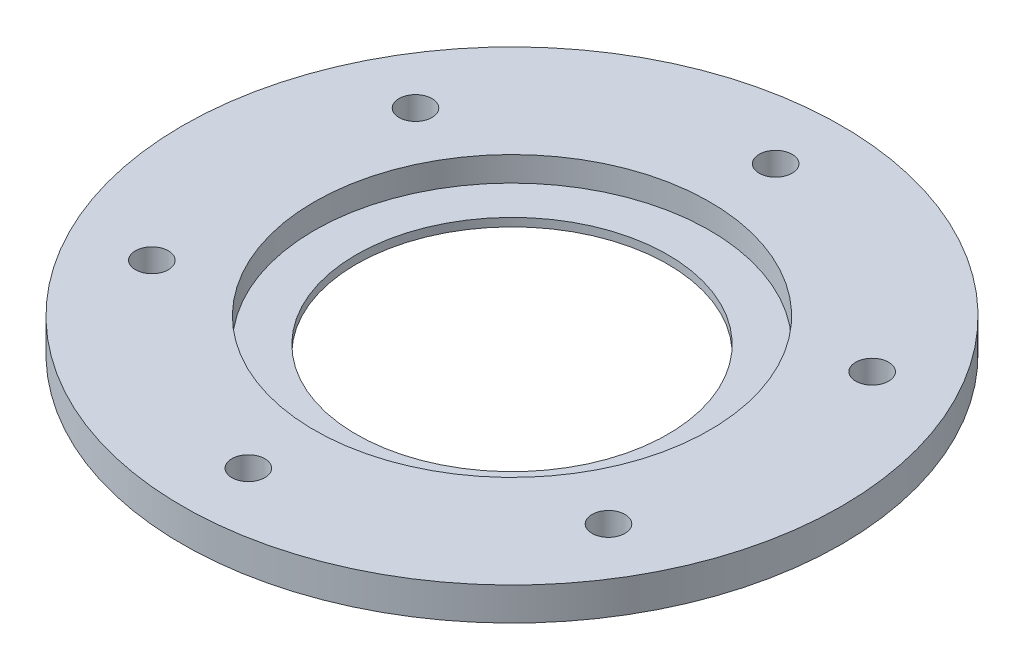
ISO-10303-21;
HEADER;
FILE_DESCRIPTION(('STEP AP214'),'2;1');
FILE_NAME('part.step','',(''),(''),'','','');
FILE_SCHEMA(('AUTOMOTIVE_DESIGN { 1 0 10303 214 1 1 1 1 }'));
ENDSEC;
DATA;
#1=APPLICATION_CONTEXT('core data for automotive mechanical design processes');
#2=APPLICATION_PROTOCOL_DEFINITION('international standard','automotive_design',2000,#1);
#3=PRODUCT_CONTEXT('',#1,'mechanical');
#4=PRODUCT('Part','Part','',(#3));
#5=PRODUCT_RELATED_PRODUCT_CATEGORY('part','',(#4));
#6=PRODUCT_DEFINITION_FORMATION('','',#4);
#7=PRODUCT_DEFINITION_CONTEXT('part definition',#1,'design');
#8=PRODUCT_DEFINITION('design','',#6,#7);
#9=PRODUCT_DEFINITION_SHAPE('','',#8);
#10=(LENGTH_UNIT() NAMED_UNIT(*) SI_UNIT(.MILLI.,.METRE.));
#11=(NAMED_UNIT(*) PLANE_ANGLE_UNIT() SI_UNIT($,.RADIAN.));
#12=(NAMED_UNIT(*) SI_UNIT($,.STERADIAN.) SOLID_ANGLE_UNIT());
#13=UNCERTAINTY_MEASURE_WITH_UNIT(LENGTH_MEASURE(1.E-05),#10,'distance_accuracy_value','');
#14=(GEOMETRIC_REPRESENTATION_CONTEXT(3) GLOBAL_UNCERTAINTY_ASSIGNED_CONTEXT((#13)) GLOBAL_UNIT_ASSIGNED_CONTEXT((#10,
#11,#12)) REPRESENTATION_CONTEXT('',''));
#15=CARTESIAN_POINT('',(0.,0.,0.));
#16=DIRECTION('',(0.,0.,1.));
#17=DIRECTION('',(1.,0.,0.));
#18=AXIS2_PLACEMENT_3D('',#15,#16,#17);
#19=CARTESIAN_POINT('',(200.,0.,0.));
#20=DIRECTION('',(0.,1.,0.));
#21=DIRECTION('',(-1.,0.,0.));
#22=AXIS2_PLACEMENT_3D('',#19,#20,#21);
#23=PLANE('',#22);
#24=CARTESIAN_POINT('',(0.,0.,-160.));
#25=DIRECTION('',(0.,1.,0.));
#26=DIRECTION('',(-1.,0.,0.));
#27=AXIS2_PLACEMENT_3D('',#24,#25,#26);
#28=CIRCLE('',#27,10.);
#29=CARTESIAN_POINT('',(-10.,0.,-160.));
#30=VERTEX_POINT('',#29);
#31=EDGE_CURVE('E57',#30,#30,#28,.F.);
#32=ORIENTED_EDGE('',*,*,#31,.F.);
#33=EDGE_LOOP('',(#32));
#34=FACE_BOUND('',#33,.T.);
#35=CARTESIAN_POINT('',(-138.564064605505,0.,-79.999999999991));
#36=DIRECTION('',(0.,1.,0.));
#37=DIRECTION('',(-1.,0.,0.));
#38=AXIS2_PLACEMENT_3D('',#35,#36,#37);
#39=CIRCLE('',#38,10.);
#40=CARTESIAN_POINT('',(-148.564064605505,0.,-79.999999999991));
#41=VERTEX_POINT('',#40);
#42=EDGE_CURVE('E65',#41,#41,#39,.F.);
#43=ORIENTED_EDGE('',*,*,#42,.F.);
#44=EDGE_LOOP('',(#43));
#45=FACE_BOUND('',#44,.T.);
#46=CARTESIAN_POINT('',(-138.564064605495,0.,80.0000000000089));
#47=DIRECTION('',(0.,1.,0.));
#48=DIRECTION('',(-1.,0.,0.));
#49=AXIS2_PLACEMENT_3D('',#46,#47,#48);
#50=CIRCLE('',#49,10.);
#51=CARTESIAN_POINT('',(-148.564064605495,0.,80.0000000000089));
#52=VERTEX_POINT('',#51);
#53=EDGE_CURVE('E58',#52,#52,#50,.F.);
#54=ORIENTED_EDGE('',*,*,#53,.F.);
#55=EDGE_LOOP('',(#54));
#56=FACE_BOUND('',#55,.T.);
#57=CARTESIAN_POINT('',(2.04218391923969E-11,0.,160.));
#58=DIRECTION('',(0.,1.,0.));
#59=DIRECTION('',(-1.,0.,0.));
#60=AXIS2_PLACEMENT_3D('',#57,#58,#59);
#61=CIRCLE('',#60,10.);
#62=CARTESIAN_POINT('',(-9.99999999997958,0.,160.));
#63=VERTEX_POINT('',#62);
#64=EDGE_CURVE('E66',#63,#63,#61,.F.);
#65=ORIENTED_EDGE('',*,*,#64,.F.);
#66=EDGE_LOOP('',(#65));
#67=FACE_BOUND('',#66,.T.);
#68=CARTESIAN_POINT('',(138.564064605526,0.,79.9999999999911));
#69=DIRECTION('',(0.,1.,0.));
#70=DIRECTION('',(-1.,0.,0.));
#71=AXIS2_PLACEMENT_3D('',#68,#69,#70);
#72=CIRCLE('',#71,10.);
#73=CARTESIAN_POINT('',(128.564064605526,0.,79.9999999999911));
#74=VERTEX_POINT('',#73);
#75=EDGE_CURVE('E72',#74,#74,#72,.F.);
#76=ORIENTED_EDGE('',*,*,#75,.F.);
#77=EDGE_LOOP('',(#76));
#78=FACE_BOUND('',#77,.T.);
#79=CARTESIAN_POINT('',(138.564064605515,0.,-80.0000000000089));
#80=DIRECTION('',(0.,1.,0.));
#81=DIRECTION('',(-1.,0.,0.));
#82=AXIS2_PLACEMENT_3D('',#79,#80,#81);
#83=CIRCLE('',#82,10.);
#84=CARTESIAN_POINT('',(128.564064605515,0.,-80.0000000000089));
#85=VERTEX_POINT('',#84);
#86=EDGE_CURVE('E78',#85,#85,#83,.F.);
#87=ORIENTED_EDGE('',*,*,#86,.F.);
#88=EDGE_LOOP('',(#87));
#89=FACE_BOUND('',#88,.T.);
#90=CARTESIAN_POINT('',(0.,0.,0.));
#91=DIRECTION('',(0.,1.,0.));
#92=DIRECTION('',(-1.,0.,0.));
#93=AXIS2_PLACEMENT_3D('',#90,#91,#92);
#94=CIRCLE('',#93,200.);
#95=CARTESIAN_POINT('',(-200.,0.,0.));
#96=VERTEX_POINT('',#95);
#97=EDGE_CURVE('E54',#96,#96,#94,.T.);
#98=ORIENTED_EDGE('',*,*,#97,.F.);
#99=EDGE_LOOP('',(#98));
#100=FACE_BOUND('',#99,.T.);
#101=CARTESIAN_POINT('',(0.,0.,0.));
#102=DIRECTION('',(0.,1.,0.));
#103=DIRECTION('',(-1.,0.,0.));
#104=AXIS2_PLACEMENT_3D('',#101,#102,#103);
#105=CIRCLE('',#104,94.5);
#106=CARTESIAN_POINT('',(-94.5,0.,0.));
#107=VERTEX_POINT('',#106);
#108=EDGE_CURVE('E10',#107,#107,#105,.T.);
#109=ORIENTED_EDGE('',*,*,#108,.T.);
#110=EDGE_LOOP('',(#109));
#111=FACE_BOUND('',#110,.T.);
#112=ADVANCED_FACE('F32',(#34,#45,#56,#67,#78,#89,#100,#111),#23,.F.);
#113=CARTESIAN_POINT('',(0.,45.9803759067654,0.));
#114=DIRECTION('',(0.,1.,0.));
#115=DIRECTION('',(-1.,0.,0.));
#116=AXIS2_PLACEMENT_3D('',#113,#114,#115);
#117=CYLINDRICAL_SURFACE('',#116,94.5);
#118=ORIENTED_EDGE('',*,*,#108,.F.);
#119=EDGE_LOOP('',(#118));
#120=FACE_BOUND('',#119,.T.);
#121=CARTESIAN_POINT('',(0.,4.99999999999999,0.));
#122=DIRECTION('',(0.,1.,0.));
#123=DIRECTION('',(-1.,0.,0.));
#124=AXIS2_PLACEMENT_3D('',#121,#122,#123);
#125=CIRCLE('',#124,94.5);
#126=CARTESIAN_POINT('',(-94.5,4.99999999999999,0.));
#127=VERTEX_POINT('',#126);
#128=EDGE_CURVE('E38',#127,#127,#125,.T.);
#129=ORIENTED_EDGE('',*,*,#128,.T.);
#130=EDGE_LOOP('',(#129));
#131=FACE_BOUND('',#130,.T.);
#132=ADVANCED_FACE('F124',(#120,#131),#117,.F.);
#133=CARTESIAN_POINT('',(94.5,4.99999999999999,0.));
#134=DIRECTION('',(0.,-1.,0.));
#135=DIRECTION('',(1.,0.,0.));
#136=AXIS2_PLACEMENT_3D('',#133,#134,#135);
#137=PLANE('',#136);
#138=ORIENTED_EDGE('',*,*,#128,.F.);
#139=EDGE_LOOP('',(#138));
#140=FACE_BOUND('',#139,.T.);
#141=CARTESIAN_POINT('',(0.,4.99999999999999,0.));
#142=DIRECTION('',(0.,1.,0.));
#143=DIRECTION('',(-1.,0.,0.));
#144=AXIS2_PLACEMENT_3D('',#141,#142,#143);
#145=CIRCLE('',#144,120.);
#146=CARTESIAN_POINT('',(-120.,4.99999999999999,0.));
#147=VERTEX_POINT('',#146);
#148=EDGE_CURVE('E42',#147,#147,#145,.T.);
#149=ORIENTED_EDGE('',*,*,#148,.T.);
#150=EDGE_LOOP('',(#149));
#151=FACE_BOUND('',#150,.T.);
#152=ADVANCED_FACE('F129',(#140,#151),#137,.F.);
#153=CARTESIAN_POINT('',(0.,45.9803759067654,0.));
#154=DIRECTION('',(0.,1.,0.));
#155=DIRECTION('',(-1.,0.,0.));
#156=AXIS2_PLACEMENT_3D('',#153,#154,#155);
#157=CYLINDRICAL_SURFACE('',#156,120.);
#158=ORIENTED_EDGE('',*,*,#148,.F.);
#159=EDGE_LOOP('',(#158));
#160=FACE_BOUND('',#159,.T.);
#161=CARTESIAN_POINT('',(0.,20.,0.));
#162=DIRECTION('',(0.,1.,0.));
#163=DIRECTION('',(-1.,0.,0.));
#164=AXIS2_PLACEMENT_3D('',#161,#162,#163);
#165=CIRCLE('',#164,120.);
#166=CARTESIAN_POINT('',(-120.,20.,0.));
#167=VERTEX_POINT('',#166);
#168=EDGE_CURVE('E46',#167,#167,#165,.T.);
#169=ORIENTED_EDGE('',*,*,#168,.T.);
#170=EDGE_LOOP('',(#169));
#171=FACE_BOUND('',#170,.T.);
#172=ADVANCED_FACE('F101',(#160,#171),#157,.F.);
#173=CARTESIAN_POINT('',(120.,20.,0.));
#174=DIRECTION('',(0.,-1.,0.));
#175=DIRECTION('',(1.,0.,0.));
#176=AXIS2_PLACEMENT_3D('',#173,#174,#175);
#177=PLANE('',#176);
#178=CARTESIAN_POINT('',(0.,20.,-160.));
#179=DIRECTION('',(0.,1.,0.));
#180=DIRECTION('',(-1.,0.,0.));
#181=AXIS2_PLACEMENT_3D('',#178,#179,#180);
#182=CIRCLE('',#181,10.);
#183=CARTESIAN_POINT('',(-10.,20.,-160.));
#184=VERTEX_POINT('',#183);
#185=EDGE_CURVE('E81',#184,#184,#182,.T.);
#186=ORIENTED_EDGE('',*,*,#185,.F.);
#187=EDGE_LOOP('',(#186));
#188=FACE_BOUND('',#187,.T.);
#189=CARTESIAN_POINT('',(-138.564064605505,20.,-79.999999999991));
#190=DIRECTION('',(0.,1.,0.));
#191=DIRECTION('',(-1.,0.,0.));
#192=AXIS2_PLACEMENT_3D('',#189,#190,#191);
#193=CIRCLE('',#192,10.);
#194=CARTESIAN_POINT('',(-148.564064605505,20.,-79.999999999991));
#195=VERTEX_POINT('',#194);
#196=EDGE_CURVE('E86',#195,#195,#193,.T.);
#197=ORIENTED_EDGE('',*,*,#196,.F.);
#198=EDGE_LOOP('',(#197));
#199=FACE_BOUND('',#198,.T.);
#200=CARTESIAN_POINT('',(-138.564064605495,20.,80.0000000000089));
#201=DIRECTION('',(0.,1.,0.));
#202=DIRECTION('',(-1.,0.,0.));
#203=AXIS2_PLACEMENT_3D('',#200,#201,#202);
#204=CIRCLE('',#203,10.);
#205=CARTESIAN_POINT('',(-148.564064605495,20.,80.0000000000089));
#206=VERTEX_POINT('',#205);
#207=EDGE_CURVE('E62',#206,#206,#204,.T.);
#208=ORIENTED_EDGE('',*,*,#207,.F.);
#209=EDGE_LOOP('',(#208));
#210=FACE_BOUND('',#209,.T.);
#211=CARTESIAN_POINT('',(2.04218806475174E-11,20.,160.));
#212=DIRECTION('',(0.,1.,0.));
#213=DIRECTION('',(-1.,0.,0.));
#214=AXIS2_PLACEMENT_3D('',#211,#212,#213);
#215=CIRCLE('',#214,10.);
#216=CARTESIAN_POINT('',(-9.99999999997958,20.,160.));
#217=VERTEX_POINT('',#216);
#218=EDGE_CURVE('E61',#217,#217,#215,.T.);
#219=ORIENTED_EDGE('',*,*,#218,.F.);
#220=EDGE_LOOP('',(#219));
#221=FACE_BOUND('',#220,.T.);
#222=CARTESIAN_POINT('',(138.564064605526,20.,79.9999999999911));
#223=DIRECTION('',(0.,1.,0.));
#224=DIRECTION('',(-1.,0.,0.));
#225=AXIS2_PLACEMENT_3D('',#222,#223,#224);
#226=CIRCLE('',#225,10.);
#227=CARTESIAN_POINT('',(128.564064605526,20.,79.9999999999911));
#228=VERTEX_POINT('',#227);
#229=EDGE_CURVE('E69',#228,#228,#226,.T.);
#230=ORIENTED_EDGE('',*,*,#229,.F.);
#231=EDGE_LOOP('',(#230));
#232=FACE_BOUND('',#231,.T.);
#233=CARTESIAN_POINT('',(138.564064605515,20.,-80.0000000000089));
#234=DIRECTION('',(0.,1.,0.));
#235=DIRECTION('',(-1.,0.,0.));
#236=AXIS2_PLACEMENT_3D('',#233,#234,#235);
#237=CIRCLE('',#236,10.);
#238=CARTESIAN_POINT('',(128.564064605515,20.,-80.0000000000089));
#239=VERTEX_POINT('',#238);
#240=EDGE_CURVE('E75',#239,#239,#237,.T.);
#241=ORIENTED_EDGE('',*,*,#240,.F.);
#242=EDGE_LOOP('',(#241));
#243=FACE_BOUND('',#242,.T.);
#244=ORIENTED_EDGE('',*,*,#168,.F.);
#245=EDGE_LOOP('',(#244));
#246=FACE_BOUND('',#245,.T.);
#247=CARTESIAN_POINT('',(0.,20.,0.));
#248=DIRECTION('',(0.,1.,0.));
#249=DIRECTION('',(-1.,0.,0.));
#250=AXIS2_PLACEMENT_3D('',#247,#248,#249);
#251=CIRCLE('',#250,200.);
#252=CARTESIAN_POINT('',(-200.,20.,0.));
#253=VERTEX_POINT('',#252);
#254=EDGE_CURVE('E51',#253,#253,#251,.T.);
#255=ORIENTED_EDGE('',*,*,#254,.T.);
#256=EDGE_LOOP('',(#255));
#257=FACE_BOUND('',#256,.T.);
#258=ADVANCED_FACE('F97',(#188,#199,#210,#221,#232,#243,#246,#257),#177,.F.);
#259=CARTESIAN_POINT('',(0.,45.9803759067654,0.));
#260=DIRECTION('',(0.,1.,0.));
#261=DIRECTION('',(-1.,0.,0.));
#262=AXIS2_PLACEMENT_3D('',#259,#260,#261);
#263=CYLINDRICAL_SURFACE('',#262,200.);
#264=ORIENTED_EDGE('',*,*,#254,.F.);
#265=EDGE_LOOP('',(#264));
#266=FACE_BOUND('',#265,.T.);
#267=ORIENTED_EDGE('',*,*,#97,.T.);
#268=EDGE_LOOP('',(#267));
#269=FACE_BOUND('',#268,.T.);
#270=ADVANCED_FACE('F100',(#266,#269),#263,.T.);
#271=CARTESIAN_POINT('',(138.564064605515,-0.00100000000001488,-80.0000000000089));
#272=DIRECTION('',(0.,1.,0.));
#273=DIRECTION('',(-1.,0.,0.));
#274=AXIS2_PLACEMENT_3D('',#271,#272,#273);
#275=CYLINDRICAL_SURFACE('',#274,10.);
#276=ORIENTED_EDGE('',*,*,#240,.T.);
#277=EDGE_LOOP('',(#276));
#278=FACE_BOUND('',#277,.T.);
#279=ORIENTED_EDGE('',*,*,#86,.T.);
#280=EDGE_LOOP('',(#279));
#281=FACE_BOUND('',#280,.T.);
#282=ADVANCED_FACE('F119',(#278,#281),#275,.F.);
#283=CARTESIAN_POINT('',(138.564064605526,-0.00100000000001488,79.9999999999911));
#284=DIRECTION('',(0.,1.,0.));
#285=DIRECTION('',(-1.,0.,0.));
#286=AXIS2_PLACEMENT_3D('',#283,#284,#285);
#287=CYLINDRICAL_SURFACE('',#286,10.);
#288=ORIENTED_EDGE('',*,*,#229,.T.);
#289=EDGE_LOOP('',(#288));
#290=FACE_BOUND('',#289,.T.);
#291=ORIENTED_EDGE('',*,*,#75,.T.);
#292=EDGE_LOOP('',(#291));
#293=FACE_BOUND('',#292,.T.);
#294=ADVANCED_FACE('F144',(#290,#293),#287,.F.);
#295=CARTESIAN_POINT('',(2.04218391903242E-11,-0.00100000000001488,160.));
#296=DIRECTION('',(0.,1.,0.));
#297=DIRECTION('',(-1.,0.,0.));
#298=AXIS2_PLACEMENT_3D('',#295,#296,#297);
#299=CYLINDRICAL_SURFACE('',#298,10.);
#300=ORIENTED_EDGE('',*,*,#218,.T.);
#301=EDGE_LOOP('',(#300));
#302=FACE_BOUND('',#301,.T.);
#303=ORIENTED_EDGE('',*,*,#64,.T.);
#304=EDGE_LOOP('',(#303));
#305=FACE_BOUND('',#304,.T.);
#306=ADVANCED_FACE('F150',(#302,#305),#299,.F.);
#307=CARTESIAN_POINT('',(-138.564064605495,-0.00100000000001488,80.0000000000089));
#308=DIRECTION('',(0.,1.,0.));
#309=DIRECTION('',(-1.,0.,0.));
#310=AXIS2_PLACEMENT_3D('',#307,#308,#309);
#311=CYLINDRICAL_SURFACE('',#310,10.);
#312=ORIENTED_EDGE('',*,*,#207,.T.);
#313=EDGE_LOOP('',(#312));
#314=FACE_BOUND('',#313,.T.);
#315=ORIENTED_EDGE('',*,*,#53,.T.);
#316=EDGE_LOOP('',(#315));
#317=FACE_BOUND('',#316,.T.);
#318=ADVANCED_FACE('F159',(#314,#317),#311,.F.);
#319=CARTESIAN_POINT('',(-138.564064605505,-0.00100000000001488,-79.999999999991));
#320=DIRECTION('',(0.,1.,0.));
#321=DIRECTION('',(-1.,0.,0.));
#322=AXIS2_PLACEMENT_3D('',#319,#320,#321);
#323=CYLINDRICAL_SURFACE('',#322,10.);
#324=ORIENTED_EDGE('',*,*,#196,.T.);
#325=EDGE_LOOP('',(#324));
#326=FACE_BOUND('',#325,.T.);
#327=ORIENTED_EDGE('',*,*,#42,.T.);
#328=EDGE_LOOP('',(#327));
#329=FACE_BOUND('',#328,.T.);
#330=ADVANCED_FACE('F154',(#326,#329),#323,.F.);
#331=CARTESIAN_POINT('',(0.,-0.00100000000001488,-160.));
#332=DIRECTION('',(0.,1.,0.));
#333=DIRECTION('',(-1.,0.,0.));
#334=AXIS2_PLACEMENT_3D('',#331,#332,#333);
#335=CYLINDRICAL_SURFACE('',#334,10.);
#336=ORIENTED_EDGE('',*,*,#185,.T.);
#337=EDGE_LOOP('',(#336));
#338=FACE_BOUND('',#337,.T.);
#339=ORIENTED_EDGE('',*,*,#31,.T.);
#340=EDGE_LOOP('',(#339));
#341=FACE_BOUND('',#340,.T.);
#342=ADVANCED_FACE('F94',(#338,#341),#335,.F.);
#343=CLOSED_SHELL('',(#112,#132,#152,#172,#258,#270,#282,#294,#306,#318,#330,#342));
#344=MANIFOLD_SOLID_BREP('B2',#343);
#345=ADVANCED_BREP_SHAPE_REPRESENTATION('',(#18,#344),#14);
#346=SHAPE_DEFINITION_REPRESENTATION(#9,#345);
ENDSEC;
END-ISO-10303-21;
